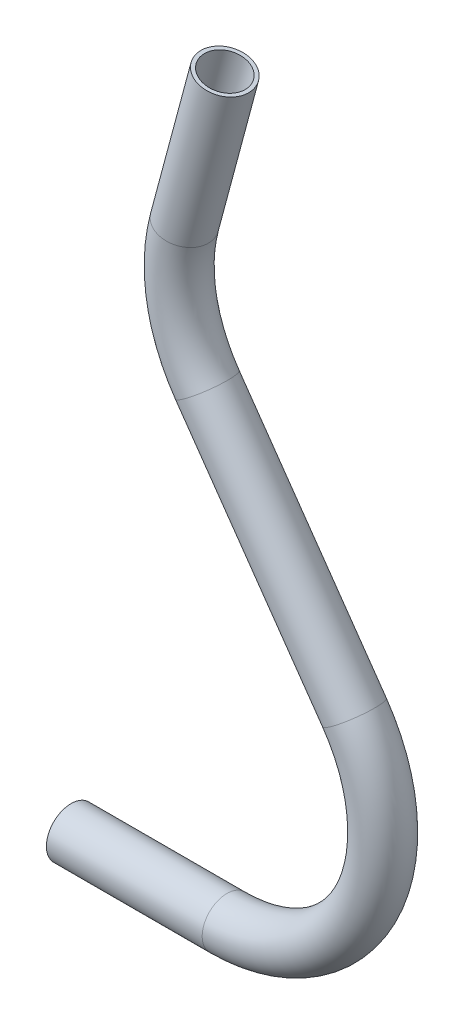
ISO-10303-21;
HEADER;
FILE_DESCRIPTION(('STEP AP214'),'2;1');
FILE_NAME('part.step','',(''),(''),'','','');
FILE_SCHEMA(('AUTOMOTIVE_DESIGN { 1 0 10303 214 1 1 1 1 }'));
ENDSEC;
DATA;
#1=APPLICATION_CONTEXT('core data for automotive mechanical design processes');
#2=APPLICATION_PROTOCOL_DEFINITION('international standard','automotive_design',2000,#1);
#3=PRODUCT_CONTEXT('',#1,'mechanical');
#4=PRODUCT('Part','Part','',(#3));
#5=PRODUCT_RELATED_PRODUCT_CATEGORY('part','',(#4));
#6=PRODUCT_DEFINITION_FORMATION('','',#4);
#7=PRODUCT_DEFINITION_CONTEXT('part definition',#1,'design');
#8=PRODUCT_DEFINITION('design','',#6,#7);
#9=PRODUCT_DEFINITION_SHAPE('','',#8);
#10=(LENGTH_UNIT() NAMED_UNIT(*) SI_UNIT(.MILLI.,.METRE.));
#11=(NAMED_UNIT(*) PLANE_ANGLE_UNIT() SI_UNIT($,.RADIAN.));
#12=(NAMED_UNIT(*) SI_UNIT($,.STERADIAN.) SOLID_ANGLE_UNIT());
#13=UNCERTAINTY_MEASURE_WITH_UNIT(LENGTH_MEASURE(1.E-05),#10,'distance_accuracy_value','');
#14=(GEOMETRIC_REPRESENTATION_CONTEXT(3) GLOBAL_UNCERTAINTY_ASSIGNED_CONTEXT((#13)) GLOBAL_UNIT_ASSIGNED_CONTEXT((#10,
#11,#12)) REPRESENTATION_CONTEXT('',''));
#15=CARTESIAN_POINT('',(0.,0.,0.));
#16=DIRECTION('',(0.,0.,1.));
#17=DIRECTION('',(1.,0.,0.));
#18=AXIS2_PLACEMENT_3D('',#15,#16,#17);
#19=CARTESIAN_POINT('',(61.8514512054111,319.188899213851,0.));
#20=DIRECTION('',(0.258819045102521,0.965925826289068,0.));
#21=DIRECTION('',(-0.965925826289068,0.258819045102521,0.));
#22=AXIS2_PLACEMENT_3D('',#19,#20,#21);
#23=CYLINDRICAL_SURFACE('',#22,13.5);
#24=CARTESIAN_POINT('',(61.8514512054111,319.188899213851,0.));
#25=DIRECTION('',(0.258819045102522,0.965925826289068,0.));
#26=DIRECTION('',(0.,0.,-1.));
#27=AXIS2_PLACEMENT_3D('',#24,#25,#26);
#28=CIRCLE('',#27,13.5);
#29=CARTESIAN_POINT('',(48.8114525505086,322.682956322735,0.));
#30=VERTEX_POINT('',#29);
#31=EDGE_CURVE('E44',#30,#30,#28,.T.);
#32=ORIENTED_EDGE('',*,*,#31,.T.);
#33=EDGE_LOOP('',(#32));
#34=FACE_BOUND('',#33,.T.);
#35=CARTESIAN_POINT('',(83.8510700391253,401.292594448422,0.));
#36=DIRECTION('',(0.258819045102522,0.965925826289068,0.));
#37=DIRECTION('',(0.,0.,-1.));
#38=AXIS2_PLACEMENT_3D('',#35,#36,#37);
#39=CIRCLE('',#38,13.5);
#40=CARTESIAN_POINT('',(83.8510700391253,401.292594448422,-13.5));
#41=VERTEX_POINT('',#40);
#42=EDGE_CURVE('E10',#41,#41,#39,.T.);
#43=ORIENTED_EDGE('',*,*,#42,.F.);
#44=EDGE_LOOP('',(#43));
#45=FACE_BOUND('',#44,.T.);
#46=ADVANCED_FACE('F34',(#34,#45),#23,.T.);
#47=CARTESIAN_POINT('',(61.8514512054111,319.188899213851,0.));
#48=DIRECTION('',(0.258819045102521,0.965925826289068,0.));
#49=DIRECTION('',(-0.965925826289068,0.258819045102521,0.));
#50=AXIS2_PLACEMENT_3D('',#47,#48,#49);
#51=CYLINDRICAL_SURFACE('',#50,11.5);
#52=CARTESIAN_POINT('',(61.8514512054111,319.188899213851,0.));
#53=DIRECTION('',(0.258819045102522,0.965925826289068,0.));
#54=DIRECTION('',(0.,0.,-1.));
#55=AXIS2_PLACEMENT_3D('',#52,#53,#54);
#56=CIRCLE('',#55,11.5);
#57=CARTESIAN_POINT('',(50.7433042030868,322.16531823253,0.));
#58=VERTEX_POINT('',#57);
#59=EDGE_CURVE('E48',#58,#58,#56,.T.);
#60=ORIENTED_EDGE('',*,*,#59,.F.);
#61=EDGE_LOOP('',(#60));
#62=FACE_BOUND('',#61,.T.);
#63=CARTESIAN_POINT('',(83.8510700391253,401.292594448422,0.));
#64=DIRECTION('',(0.258819045102522,0.965925826289068,0.));
#65=DIRECTION('',(0.,0.,-1.));
#66=AXIS2_PLACEMENT_3D('',#63,#64,#65);
#67=CIRCLE('',#66,11.5);
#68=CARTESIAN_POINT('',(83.8510700391253,401.292594448422,-11.5));
#69=VERTEX_POINT('',#68);
#70=EDGE_CURVE('E40',#69,#69,#67,.T.);
#71=ORIENTED_EDGE('',*,*,#70,.T.);
#72=EDGE_LOOP('',(#71));
#73=FACE_BOUND('',#72,.T.);
#74=ADVANCED_FACE('F98',(#62,#73),#51,.F.);
#75=CARTESIAN_POINT('',(143.955146439982,297.189280380137,0.));
#76=DIRECTION('',(0.,0.,-1.));
#77=DIRECTION('',(-1.,0.,0.));
#78=AXIS2_PLACEMENT_3D('',#75,#76,#77);
#79=TOROIDAL_SURFACE('',#78,85.,13.5);
#80=CARTESIAN_POINT('',(74.3272226754176,248.435283290298,0.));
#81=DIRECTION('',(-0.573576436351047,0.819152044288991,0.));
#82=DIRECTION('',(0.,0.,-1.));
#83=AXIS2_PLACEMENT_3D('',#80,#81,#82);
#84=CIRCLE('',#83,13.5);
#85=CARTESIAN_POINT('',(63.2686700775162,240.692001399559,0.));
#86=VERTEX_POINT('',#85);
#87=EDGE_CURVE('E53',#86,#86,#84,.T.);
#88=CARTESIAN_POINT('',(143.955146439982,297.189280380137,0.));
#89=DIRECTION('',(0.,0.,-1.));
#90=DIRECTION('',(-1.,0.,0.));
#91=AXIS2_PLACEMENT_3D('',#88,#89,#90);
#92=CIRCLE('',#91,98.5);
#93=EDGE_CURVE('',#86,#30,#92,.T.);
#94=ORIENTED_EDGE('',*,*,#87,.T.);
#95=ORIENTED_EDGE('',*,*,#31,.F.);
#96=ORIENTED_EDGE('',*,*,#93,.T.);
#97=ORIENTED_EDGE('',*,*,#93,.F.);
#98=EDGE_LOOP('',(#94,#96,#95,#97));
#99=FACE_BOUND('',#98,.T.);
#100=ADVANCED_FACE('F103',(#99),#79,.T.);
#101=CARTESIAN_POINT('',(143.955146439982,297.189280380137,0.));
#102=DIRECTION('',(0.,0.,-1.));
#103=DIRECTION('',(-1.,0.,0.));
#104=AXIS2_PLACEMENT_3D('',#101,#102,#103);
#105=TOROIDAL_SURFACE('',#104,85.,11.5);
#106=CARTESIAN_POINT('',(74.3272226754176,248.435283290298,0.));
#107=DIRECTION('',(-0.573576436351047,0.819152044288991,0.));
#108=DIRECTION('',(0.,0.,-1.));
#109=AXIS2_PLACEMENT_3D('',#106,#107,#108);
#110=CIRCLE('',#109,11.5);
#111=CARTESIAN_POINT('',(64.9069741660942,241.839154272261,0.));
#112=VERTEX_POINT('',#111);
#113=EDGE_CURVE('E56',#112,#112,#110,.T.);
#114=CARTESIAN_POINT('',(143.955146439982,297.189280380137,0.));
#115=DIRECTION('',(0.,0.,-1.));
#116=DIRECTION('',(-1.,0.,0.));
#117=AXIS2_PLACEMENT_3D('',#114,#115,#116);
#118=CIRCLE('',#117,96.5);
#119=EDGE_CURVE('',#112,#58,#118,.T.);
#120=ORIENTED_EDGE('',*,*,#113,.F.);
#121=ORIENTED_EDGE('',*,*,#59,.T.);
#122=ORIENTED_EDGE('',*,*,#119,.T.);
#123=ORIENTED_EDGE('',*,*,#119,.F.);
#124=EDGE_LOOP('',(#120,#122,#121,#123));
#125=FACE_BOUND('',#124,.T.);
#126=ADVANCED_FACE('F109',(#125),#105,.F.);
#127=CARTESIAN_POINT('',(154.627923764564,133.753997089839,0.));
#128=DIRECTION('',(-0.573576436351048,0.819152044288991,0.));
#129=DIRECTION('',(-0.819152044288991,-0.573576436351048,0.));
#130=AXIS2_PLACEMENT_3D('',#127,#128,#129);
#131=CYLINDRICAL_SURFACE('',#130,13.5);
#132=CARTESIAN_POINT('',(154.627923764564,133.753997089839,0.));
#133=DIRECTION('',(-0.573576436351047,0.819152044288991,0.));
#134=DIRECTION('',(0.,0.,-1.));
#135=AXIS2_PLACEMENT_3D('',#132,#133,#134);
#136=CIRCLE('',#135,13.5);
#137=CARTESIAN_POINT('',(165.686476362466,141.497278980578,0.));
#138=VERTEX_POINT('',#137);
#139=EDGE_CURVE('E59',#138,#138,#136,.T.);
#140=ORIENTED_EDGE('',*,*,#139,.T.);
#141=EDGE_LOOP('',(#140));
#142=FACE_BOUND('',#141,.T.);
#143=ORIENTED_EDGE('',*,*,#87,.F.);
#144=EDGE_LOOP('',(#143));
#145=FACE_BOUND('',#144,.T.);
#146=ADVANCED_FACE('F115',(#142,#145),#131,.T.);
#147=CARTESIAN_POINT('',(154.627923764564,133.753997089839,0.));
#148=DIRECTION('',(-0.573576436351048,0.819152044288991,0.));
#149=DIRECTION('',(-0.819152044288991,-0.573576436351048,0.));
#150=AXIS2_PLACEMENT_3D('',#147,#148,#149);
#151=CYLINDRICAL_SURFACE('',#150,11.5);
#152=CARTESIAN_POINT('',(154.627923764564,133.753997089839,0.));
#153=DIRECTION('',(-0.573576436351047,0.819152044288991,0.));
#154=DIRECTION('',(0.,0.,-1.));
#155=AXIS2_PLACEMENT_3D('',#152,#153,#154);
#156=CIRCLE('',#155,11.5);
#157=CARTESIAN_POINT('',(164.048172273888,140.350126107876,0.));
#158=VERTEX_POINT('',#157);
#159=EDGE_CURVE('E62',#158,#158,#156,.T.);
#160=ORIENTED_EDGE('',*,*,#159,.F.);
#161=EDGE_LOOP('',(#160));
#162=FACE_BOUND('',#161,.T.);
#163=ORIENTED_EDGE('',*,*,#113,.T.);
#164=EDGE_LOOP('',(#163));
#165=FACE_BOUND('',#164,.T.);
#166=ADVANCED_FACE('F121',(#162,#165),#151,.F.);
#167=CARTESIAN_POINT('',(85.,85.,0.));
#168=DIRECTION('',(0.,0.,1.));
#169=DIRECTION('',(1.,0.,0.));
#170=AXIS2_PLACEMENT_3D('',#167,#168,#169);
#171=TOROIDAL_SURFACE('',#170,85.,13.5);
#172=CARTESIAN_POINT('',(85.,0.,0.));
#173=DIRECTION('',(1.,0.,0.));
#174=DIRECTION('',(0.,0.,-1.));
#175=AXIS2_PLACEMENT_3D('',#172,#173,#174);
#176=CIRCLE('',#175,13.5);
#177=CARTESIAN_POINT('',(85.,-13.5,0.));
#178=VERTEX_POINT('',#177);
#179=EDGE_CURVE('E65',#178,#178,#176,.T.);
#180=CARTESIAN_POINT('',(85.,85.,0.));
#181=DIRECTION('',(0.,0.,1.));
#182=DIRECTION('',(1.,0.,0.));
#183=AXIS2_PLACEMENT_3D('',#180,#181,#182);
#184=CIRCLE('',#183,98.5);
#185=EDGE_CURVE('',#178,#138,#184,.T.);
#186=ORIENTED_EDGE('',*,*,#179,.T.);
#187=ORIENTED_EDGE('',*,*,#139,.F.);
#188=ORIENTED_EDGE('',*,*,#185,.T.);
#189=ORIENTED_EDGE('',*,*,#185,.F.);
#190=EDGE_LOOP('',(#186,#188,#187,#189));
#191=FACE_BOUND('',#190,.T.);
#192=ADVANCED_FACE('F94',(#191),#171,.T.);
#193=CARTESIAN_POINT('',(85.,85.,0.));
#194=DIRECTION('',(0.,0.,1.));
#195=DIRECTION('',(1.,0.,0.));
#196=AXIS2_PLACEMENT_3D('',#193,#194,#195);
#197=TOROIDAL_SURFACE('',#196,85.,11.5);
#198=CARTESIAN_POINT('',(85.,0.,0.));
#199=DIRECTION('',(1.,0.,0.));
#200=DIRECTION('',(0.,0.,-1.));
#201=AXIS2_PLACEMENT_3D('',#198,#199,#200);
#202=CIRCLE('',#201,11.5);
#203=CARTESIAN_POINT('',(85.,-11.5,0.));
#204=VERTEX_POINT('',#203);
#205=EDGE_CURVE('E68',#204,#204,#202,.T.);
#206=CARTESIAN_POINT('',(85.,85.,0.));
#207=DIRECTION('',(0.,0.,1.));
#208=DIRECTION('',(1.,0.,0.));
#209=AXIS2_PLACEMENT_3D('',#206,#207,#208);
#210=CIRCLE('',#209,96.5);
#211=EDGE_CURVE('',#204,#158,#210,.T.);
#212=ORIENTED_EDGE('',*,*,#205,.F.);
#213=ORIENTED_EDGE('',*,*,#159,.T.);
#214=ORIENTED_EDGE('',*,*,#211,.T.);
#215=ORIENTED_EDGE('',*,*,#211,.F.);
#216=EDGE_LOOP('',(#212,#214,#213,#215));
#217=FACE_BOUND('',#216,.T.);
#218=ADVANCED_FACE('F84',(#217),#197,.F.);
#219=CARTESIAN_POINT('',(85.,0.,0.));
#220=DIRECTION('',(-1.,0.,0.));
#221=DIRECTION('',(0.,0.,1.));
#222=AXIS2_PLACEMENT_3D('',#219,#220,#221);
#223=CYLINDRICAL_SURFACE('',#222,11.5);
#224=ORIENTED_EDGE('',*,*,#205,.T.);
#225=EDGE_LOOP('',(#224));
#226=FACE_BOUND('',#225,.T.);
#227=CARTESIAN_POINT('',(0.,0.,0.));
#228=DIRECTION('',(1.,0.,0.));
#229=DIRECTION('',(0.,0.,-1.));
#230=AXIS2_PLACEMENT_3D('',#227,#228,#229);
#231=CIRCLE('',#230,11.5);
#232=CARTESIAN_POINT('',(0.,0.,-11.5));
#233=VERTEX_POINT('',#232);
#234=EDGE_CURVE('E74',#233,#233,#231,.T.);
#235=ORIENTED_EDGE('',*,*,#234,.F.);
#236=EDGE_LOOP('',(#235));
#237=FACE_BOUND('',#236,.T.);
#238=ADVANCED_FACE('F81',(#226,#237),#223,.F.);
#239=CARTESIAN_POINT('',(85.,0.,0.));
#240=DIRECTION('',(-1.,0.,0.));
#241=DIRECTION('',(0.,0.,1.));
#242=AXIS2_PLACEMENT_3D('',#239,#240,#241);
#243=CYLINDRICAL_SURFACE('',#242,13.5);
#244=ORIENTED_EDGE('',*,*,#179,.F.);
#245=EDGE_LOOP('',(#244));
#246=FACE_BOUND('',#245,.T.);
#247=CARTESIAN_POINT('',(0.,0.,0.));
#248=DIRECTION('',(1.,0.,0.));
#249=DIRECTION('',(0.,0.,-1.));
#250=AXIS2_PLACEMENT_3D('',#247,#248,#249);
#251=CIRCLE('',#250,13.5);
#252=CARTESIAN_POINT('',(0.,0.,-13.5));
#253=VERTEX_POINT('',#252);
#254=EDGE_CURVE('E71',#253,#253,#251,.T.);
#255=ORIENTED_EDGE('',*,*,#254,.T.);
#256=EDGE_LOOP('',(#255));
#257=FACE_BOUND('',#256,.T.);
#258=ADVANCED_FACE('F83',(#246,#257),#243,.T.);
#259=CARTESIAN_POINT('',(83.8510700391253,401.292594448422,0.));
#260=DIRECTION('',(0.258819045102522,0.965925826289068,0.));
#261=DIRECTION('',(0.,0.,-1.));
#262=AXIS2_PLACEMENT_3D('',#259,#260,#261);
#263=PLANE('',#262);
#264=ORIENTED_EDGE('',*,*,#70,.F.);
#265=EDGE_LOOP('',(#264));
#266=FACE_BOUND('',#265,.T.);
#267=ORIENTED_EDGE('',*,*,#42,.T.);
#268=EDGE_LOOP('',(#267));
#269=FACE_BOUND('',#268,.T.);
#270=ADVANCED_FACE('F91',(#266,#269),#263,.T.);
#271=CARTESIAN_POINT('',(0.,0.,0.));
#272=DIRECTION('',(1.,0.,0.));
#273=DIRECTION('',(0.,0.,-1.));
#274=AXIS2_PLACEMENT_3D('',#271,#272,#273);
#275=PLANE('',#274);
#276=ORIENTED_EDGE('',*,*,#234,.T.);
#277=EDGE_LOOP('',(#276));
#278=FACE_BOUND('',#277,.T.);
#279=ORIENTED_EDGE('',*,*,#254,.F.);
#280=EDGE_LOOP('',(#279));
#281=FACE_BOUND('',#280,.T.);
#282=ADVANCED_FACE('F78',(#278,#281),#275,.F.);
#283=CLOSED_SHELL('',(#46,#74,#100,#126,#146,#166,#192,#218,#238,#258,#270,#282));
#284=MANIFOLD_SOLID_BREP('B2',#283);
#285=ADVANCED_BREP_SHAPE_REPRESENTATION('',(#18,#284),#14);
#286=SHAPE_DEFINITION_REPRESENTATION(#9,#285);
ENDSEC;
END-ISO-10303-21;
